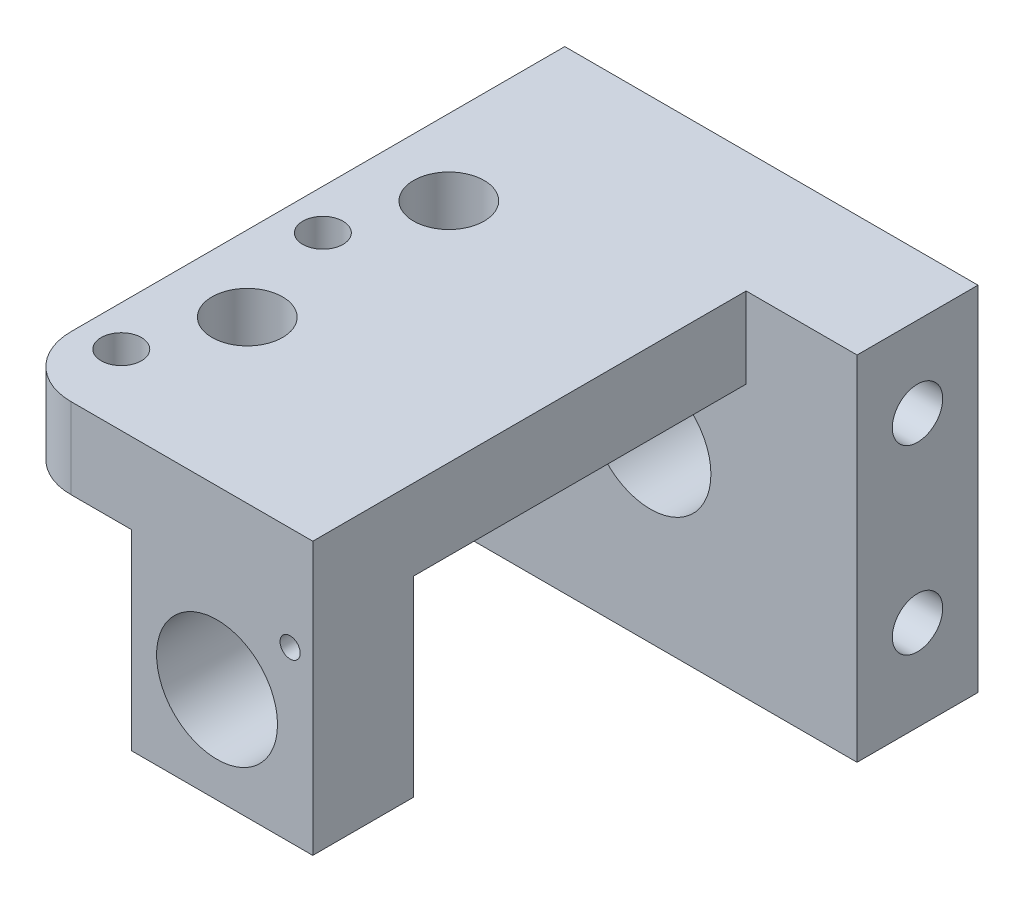
ISO-10303-21;
HEADER;
FILE_DESCRIPTION(('STEP AP214'),'2;1');
FILE_NAME('part.step','',(''),(''),'','','');
FILE_SCHEMA(('AUTOMOTIVE_DESIGN { 1 0 10303 214 1 1 1 1 }'));
ENDSEC;
DATA;
#1=APPLICATION_CONTEXT('core data for automotive mechanical design processes');
#2=APPLICATION_PROTOCOL_DEFINITION('international standard','automotive_design',2000,#1);
#3=PRODUCT_CONTEXT('',#1,'mechanical');
#4=PRODUCT('Part','Part','',(#3));
#5=PRODUCT_RELATED_PRODUCT_CATEGORY('part','',(#4));
#6=PRODUCT_DEFINITION_FORMATION('','',#4);
#7=PRODUCT_DEFINITION_CONTEXT('part definition',#1,'design');
#8=PRODUCT_DEFINITION('design','',#6,#7);
#9=PRODUCT_DEFINITION_SHAPE('','',#8);
#10=(LENGTH_UNIT() NAMED_UNIT(*) SI_UNIT(.MILLI.,.METRE.));
#11=(NAMED_UNIT(*) PLANE_ANGLE_UNIT() SI_UNIT($,.RADIAN.));
#12=(NAMED_UNIT(*) SI_UNIT($,.STERADIAN.) SOLID_ANGLE_UNIT());
#13=UNCERTAINTY_MEASURE_WITH_UNIT(LENGTH_MEASURE(1.E-05),#10,'distance_accuracy_value','');
#14=(GEOMETRIC_REPRESENTATION_CONTEXT(3) GLOBAL_UNCERTAINTY_ASSIGNED_CONTEXT((#13)) GLOBAL_UNIT_ASSIGNED_CONTEXT((#10,
#11,#12)) REPRESENTATION_CONTEXT('',''));
#15=CARTESIAN_POINT('',(0.,0.,0.));
#16=DIRECTION('',(0.,0.,1.));
#17=DIRECTION('',(1.,0.,0.));
#18=AXIS2_PLACEMENT_3D('',#15,#16,#17);
#19=CARTESIAN_POINT('',(-20.5,17.5,12.));
#20=DIRECTION('',(0.,-1.,0.));
#21=DIRECTION('',(1.,0.,0.));
#22=AXIS2_PLACEMENT_3D('',#19,#20,#21);
#23=PLANE('',#22);
#24=CARTESIAN_POINT('',(-13.,17.5,39.));
#25=DIRECTION('',(0.,1.,0.));
#26=DIRECTION('',(0.,0.,1.));
#27=AXIS2_PLACEMENT_3D('',#24,#25,#26);
#28=CIRCLE('',#27,3.49999999999999);
#29=CARTESIAN_POINT('',(-13.,17.5,42.5));
#30=VERTEX_POINT('',#29);
#31=EDGE_CURVE('E182',#30,#30,#28,.T.);
#32=ORIENTED_EDGE('',*,*,#31,.F.);
#33=EDGE_LOOP('',(#32));
#34=FACE_BOUND('',#33,.T.);
#35=CARTESIAN_POINT('',(-13.,17.5,19.));
#36=DIRECTION('',(0.,1.,0.));
#37=DIRECTION('',(0.,0.,1.));
#38=AXIS2_PLACEMENT_3D('',#35,#36,#37);
#39=CIRCLE('',#38,3.49999999999999);
#40=CARTESIAN_POINT('',(-13.,17.5,22.5));
#41=VERTEX_POINT('',#40);
#42=EDGE_CURVE('E191',#41,#41,#39,.T.);
#43=ORIENTED_EDGE('',*,*,#42,.F.);
#44=EDGE_LOOP('',(#43));
#45=FACE_BOUND('',#44,.T.);
#46=CARTESIAN_POINT('',(-16.5,17.5,48.));
#47=DIRECTION('',(0.,1.,0.));
#48=DIRECTION('',(0.,0.,1.));
#49=AXIS2_PLACEMENT_3D('',#46,#47,#48);
#50=CIRCLE('',#49,1.99999999999999);
#51=CARTESIAN_POINT('',(-16.5,17.5,50.));
#52=VERTEX_POINT('',#51);
#53=EDGE_CURVE('E197',#52,#52,#50,.T.);
#54=ORIENTED_EDGE('',*,*,#53,.F.);
#55=EDGE_LOOP('',(#54));
#56=FACE_BOUND('',#55,.T.);
#57=DIRECTION('',(0.,0.,-1.));
#58=VECTOR('',#57,1.);
#59=CARTESIAN_POINT('',(-20.5,17.5,12.));
#60=LINE('',#59,#58);
#61=CARTESIAN_POINT('',(-20.5,17.5,49.));
#62=VERTEX_POINT('',#61);
#63=CARTESIAN_POINT('',(-20.5,17.5,0.));
#64=VERTEX_POINT('',#63);
#65=EDGE_CURVE('E277',#62,#64,#60,.T.);
#66=ORIENTED_EDGE('',*,*,#65,.F.);
#67=CARTESIAN_POINT('',(-14.5,17.5,49.));
#68=DIRECTION('',(0.,-1.,0.));
#69=DIRECTION('',(1.,0.,0.));
#70=AXIS2_PLACEMENT_3D('',#67,#68,#69);
#71=CIRCLE('',#70,6.);
#72=CARTESIAN_POINT('',(-14.5,17.5,55.));
#73=VERTEX_POINT('',#72);
#74=EDGE_CURVE('E69',#62,#73,#71,.F.);
#75=ORIENTED_EDGE('',*,*,#74,.T.);
#76=DIRECTION('',(1.,0.,0.));
#77=VECTOR('',#76,1.);
#78=CARTESIAN_POINT('',(-20.5,17.5,55.));
#79=LINE('',#78,#77);
#80=CARTESIAN_POINT('',(9.5,17.5,55.));
#81=VERTEX_POINT('',#80);
#82=EDGE_CURVE('E227',#73,#81,#79,.T.);
#83=ORIENTED_EDGE('',*,*,#82,.T.);
#84=DIRECTION('',(0.,0.,-1.));
#85=VECTOR('',#84,1.);
#86=CARTESIAN_POINT('',(9.49999999999999,17.5,0.));
#87=LINE('',#86,#85);
#88=CARTESIAN_POINT('',(9.49999999999999,17.5,12.));
#89=VERTEX_POINT('',#88);
#90=EDGE_CURVE('E236',#81,#89,#87,.T.);
#91=ORIENTED_EDGE('',*,*,#90,.T.);
#92=DIRECTION('',(-1.,0.,0.));
#93=VECTOR('',#92,1.);
#94=CARTESIAN_POINT('',(-20.5,17.5,12.));
#95=LINE('',#94,#93);
#96=CARTESIAN_POINT('',(20.5,17.5,12.));
#97=VERTEX_POINT('',#96);
#98=EDGE_CURVE('E256',#97,#89,#95,.T.);
#99=ORIENTED_EDGE('',*,*,#98,.F.);
#100=DIRECTION('',(0.,0.,-1.));
#101=VECTOR('',#100,1.);
#102=CARTESIAN_POINT('',(20.5,17.5,12.));
#103=LINE('',#102,#101);
#104=CARTESIAN_POINT('',(20.5,17.5,0.));
#105=VERTEX_POINT('',#104);
#106=EDGE_CURVE('E279',#97,#105,#103,.T.);
#107=ORIENTED_EDGE('',*,*,#106,.T.);
#108=DIRECTION('',(-1.,0.,0.));
#109=VECTOR('',#108,1.);
#110=CARTESIAN_POINT('',(-20.5,17.5,0.));
#111=LINE('',#110,#109);
#112=EDGE_CURVE('E266',#105,#64,#111,.T.);
#113=ORIENTED_EDGE('',*,*,#112,.T.);
#114=EDGE_LOOP('',(#66,#75,#83,#91,#99,#107,#113));
#115=FACE_BOUND('',#114,.T.);
#116=CARTESIAN_POINT('',(-16.5,17.5,28.));
#117=DIRECTION('',(0.,1.,0.));
#118=DIRECTION('',(0.,0.,1.));
#119=AXIS2_PLACEMENT_3D('',#116,#117,#118);
#120=CIRCLE('',#119,1.99999999999999);
#121=CARTESIAN_POINT('',(-16.5,17.5,30.));
#122=VERTEX_POINT('',#121);
#123=EDGE_CURVE('E201',#122,#122,#120,.T.);
#124=ORIENTED_EDGE('',*,*,#123,.F.);
#125=EDGE_LOOP('',(#124));
#126=FACE_BOUND('',#125,.T.);
#127=ADVANCED_FACE('F45',(#34,#45,#56,#115,#126),#23,.F.);
#128=CARTESIAN_POINT('',(20.5,-17.5,12.));
#129=DIRECTION('',(-1.,0.,0.));
#130=DIRECTION('',(0.,-1.,0.));
#131=AXIS2_PLACEMENT_3D('',#128,#129,#130);
#132=PLANE('',#131);
#133=CARTESIAN_POINT('',(20.5,9.5,6.));
#134=DIRECTION('',(1.,0.,0.));
#135=DIRECTION('',(0.,0.,-1.));
#136=AXIS2_PLACEMENT_3D('',#133,#134,#135);
#137=CIRCLE('',#136,2.49999999999999);
#138=CARTESIAN_POINT('',(20.5,9.5,3.50000000000001));
#139=VERTEX_POINT('',#138);
#140=EDGE_CURVE('E161',#139,#139,#137,.T.);
#141=ORIENTED_EDGE('',*,*,#140,.F.);
#142=EDGE_LOOP('',(#141));
#143=FACE_BOUND('',#142,.T.);
#144=CARTESIAN_POINT('',(20.5,-8.5,6.));
#145=DIRECTION('',(1.,0.,0.));
#146=DIRECTION('',(0.,0.,-1.));
#147=AXIS2_PLACEMENT_3D('',#144,#145,#146);
#148=CIRCLE('',#147,2.49999999999999);
#149=CARTESIAN_POINT('',(20.5,-8.5,3.50000000000001));
#150=VERTEX_POINT('',#149);
#151=EDGE_CURVE('E167',#150,#150,#148,.T.);
#152=ORIENTED_EDGE('',*,*,#151,.F.);
#153=EDGE_LOOP('',(#152));
#154=FACE_BOUND('',#153,.T.);
#155=DIRECTION('',(0.,1.,0.));
#156=VECTOR('',#155,1.);
#157=CARTESIAN_POINT('',(20.5,-17.5,0.));
#158=LINE('',#157,#156);
#159=CARTESIAN_POINT('',(20.5,-17.5,0.));
#160=VERTEX_POINT('',#159);
#161=EDGE_CURVE('E252',#160,#105,#158,.T.);
#162=ORIENTED_EDGE('',*,*,#161,.T.);
#163=ORIENTED_EDGE('',*,*,#106,.F.);
#164=DIRECTION('',(0.,1.,0.));
#165=VECTOR('',#164,1.);
#166=CARTESIAN_POINT('',(20.5,-17.5,12.));
#167=LINE('',#166,#165);
#168=CARTESIAN_POINT('',(20.5,-17.5,12.));
#169=VERTEX_POINT('',#168);
#170=EDGE_CURVE('E253',#169,#97,#167,.T.);
#171=ORIENTED_EDGE('',*,*,#170,.F.);
#172=DIRECTION('',(0.,0.,-1.));
#173=VECTOR('',#172,1.);
#174=CARTESIAN_POINT('',(20.5,-17.5,12.));
#175=LINE('',#174,#173);
#176=EDGE_CURVE('E263',#169,#160,#175,.T.);
#177=ORIENTED_EDGE('',*,*,#176,.T.);
#178=EDGE_LOOP('',(#162,#163,#171,#177));
#179=FACE_BOUND('',#178,.T.);
#180=ADVANCED_FACE('F310',(#143,#154,#179),#132,.F.);
#181=CARTESIAN_POINT('',(-20.5,-17.5,12.));
#182=DIRECTION('',(1.,0.,0.));
#183=DIRECTION('',(0.,1.,0.));
#184=AXIS2_PLACEMENT_3D('',#181,#182,#183);
#185=PLANE('',#184);
#186=CARTESIAN_POINT('',(-20.5,9.5,6.));
#187=DIRECTION('',(-1.,0.,0.));
#188=DIRECTION('',(0.,0.,1.));
#189=AXIS2_PLACEMENT_3D('',#186,#187,#188);
#190=CIRCLE('',#189,2.49999999999999);
#191=CARTESIAN_POINT('',(-20.5,9.5,8.49999999999999));
#192=VERTEX_POINT('',#191);
#193=EDGE_CURVE('E149',#192,#192,#190,.T.);
#194=ORIENTED_EDGE('',*,*,#193,.F.);
#195=EDGE_LOOP('',(#194));
#196=FACE_BOUND('',#195,.T.);
#197=CARTESIAN_POINT('',(-20.5,-8.5,6.));
#198=DIRECTION('',(-1.,0.,0.));
#199=DIRECTION('',(0.,0.,1.));
#200=AXIS2_PLACEMENT_3D('',#197,#198,#199);
#201=CIRCLE('',#200,2.49999999999999);
#202=CARTESIAN_POINT('',(-20.5,-8.5,8.49999999999999));
#203=VERTEX_POINT('',#202);
#204=EDGE_CURVE('E148',#203,#203,#201,.T.);
#205=ORIENTED_EDGE('',*,*,#204,.F.);
#206=EDGE_LOOP('',(#205));
#207=FACE_BOUND('',#206,.T.);
#208=DIRECTION('',(0.,0.,1.));
#209=VECTOR('',#208,1.);
#210=CARTESIAN_POINT('',(-20.5,9.5,0.));
#211=LINE('',#210,#209);
#212=CARTESIAN_POINT('',(-20.5,9.5,12.));
#213=VERTEX_POINT('',#212);
#214=CARTESIAN_POINT('',(-20.5,9.5,49.));
#215=VERTEX_POINT('',#214);
#216=EDGE_CURVE('E232',#213,#215,#211,.T.);
#217=ORIENTED_EDGE('',*,*,#216,.T.);
#218=DIRECTION('',(0.,1.,0.));
#219=VECTOR('',#218,1.);
#220=CARTESIAN_POINT('',(-20.5,17.5,49.));
#221=LINE('',#220,#219);
#222=EDGE_CURVE('E282',#215,#62,#221,.T.);
#223=ORIENTED_EDGE('',*,*,#222,.T.);
#224=ORIENTED_EDGE('',*,*,#65,.T.);
#225=DIRECTION('',(0.,-1.,0.));
#226=VECTOR('',#225,1.);
#227=CARTESIAN_POINT('',(-20.5,-17.5,0.));
#228=LINE('',#227,#226);
#229=CARTESIAN_POINT('',(-20.5,-17.5,0.));
#230=VERTEX_POINT('',#229);
#231=EDGE_CURVE('E269',#64,#230,#228,.T.);
#232=ORIENTED_EDGE('',*,*,#231,.T.);
#233=DIRECTION('',(0.,0.,-1.));
#234=VECTOR('',#233,1.);
#235=CARTESIAN_POINT('',(-20.5,-17.5,12.));
#236=LINE('',#235,#234);
#237=CARTESIAN_POINT('',(-20.5,-17.5,12.));
#238=VERTEX_POINT('',#237);
#239=EDGE_CURVE('E274',#238,#230,#236,.T.);
#240=ORIENTED_EDGE('',*,*,#239,.F.);
#241=DIRECTION('',(0.,-1.,0.));
#242=VECTOR('',#241,1.);
#243=CARTESIAN_POINT('',(-20.5,-17.5,12.));
#244=LINE('',#243,#242);
#245=EDGE_CURVE('E259',#213,#238,#244,.T.);
#246=ORIENTED_EDGE('',*,*,#245,.F.);
#247=EDGE_LOOP('',(#217,#223,#224,#232,#240,#246));
#248=FACE_BOUND('',#247,.T.);
#249=ADVANCED_FACE('F317',(#196,#207,#248),#185,.F.);
#250=CARTESIAN_POINT('',(-20.5,-17.5,12.));
#251=DIRECTION('',(0.,1.,0.));
#252=DIRECTION('',(-1.,0.,0.));
#253=AXIS2_PLACEMENT_3D('',#250,#251,#252);
#254=PLANE('',#253);
#255=DIRECTION('',(1.,0.,0.));
#256=VECTOR('',#255,1.);
#257=CARTESIAN_POINT('',(-20.5,-17.5,0.));
#258=LINE('',#257,#256);
#259=EDGE_CURVE('E257',#230,#160,#258,.T.);
#260=ORIENTED_EDGE('',*,*,#259,.T.);
#261=ORIENTED_EDGE('',*,*,#176,.F.);
#262=DIRECTION('',(1.,0.,0.));
#263=VECTOR('',#262,1.);
#264=CARTESIAN_POINT('',(-20.5,-17.5,12.));
#265=LINE('',#264,#263);
#266=EDGE_CURVE('E261',#238,#169,#265,.T.);
#267=ORIENTED_EDGE('',*,*,#266,.F.);
#268=ORIENTED_EDGE('',*,*,#239,.T.);
#269=EDGE_LOOP('',(#260,#261,#267,#268));
#270=FACE_BOUND('',#269,.T.);
#271=ADVANCED_FACE('F324',(#270),#254,.F.);
#272=CARTESIAN_POINT('',(0.,0.,12.));
#273=DIRECTION('',(0.,0.,-1.));
#274=DIRECTION('',(-1.,0.,0.));
#275=AXIS2_PLACEMENT_3D('',#272,#273,#274);
#276=PLANE('',#275);
#277=CARTESIAN_POINT('',(0.,0.,12.));
#278=DIRECTION('',(0.,0.,-1.));
#279=DIRECTION('',(-1.,0.,0.));
#280=AXIS2_PLACEMENT_3D('',#277,#278,#279);
#281=CIRCLE('',#280,6.);
#282=CARTESIAN_POINT('',(-6.,0.,12.));
#283=VERTEX_POINT('',#282);
#284=EDGE_CURVE('E155',#283,#283,#281,.T.);
#285=ORIENTED_EDGE('',*,*,#284,.T.);
#286=EDGE_LOOP('',(#285));
#287=FACE_BOUND('',#286,.T.);
#288=ORIENTED_EDGE('',*,*,#98,.T.);
#289=DIRECTION('',(0.,-1.,0.));
#290=VECTOR('',#289,1.);
#291=CARTESIAN_POINT('',(9.49999999999999,0.,12.));
#292=LINE('',#291,#290);
#293=CARTESIAN_POINT('',(9.5,9.5,12.));
#294=VERTEX_POINT('',#293);
#295=EDGE_CURVE('E249',#89,#294,#292,.T.);
#296=ORIENTED_EDGE('',*,*,#295,.T.);
#297=DIRECTION('',(1.,0.,0.));
#298=VECTOR('',#297,1.);
#299=CARTESIAN_POINT('',(0.,9.5,12.));
#300=LINE('',#299,#298);
#301=EDGE_CURVE('E246',#213,#294,#300,.T.);
#302=ORIENTED_EDGE('',*,*,#301,.F.);
#303=ORIENTED_EDGE('',*,*,#245,.T.);
#304=ORIENTED_EDGE('',*,*,#266,.T.);
#305=ORIENTED_EDGE('',*,*,#170,.T.);
#306=EDGE_LOOP('',(#288,#296,#302,#303,#304,#305));
#307=FACE_BOUND('',#306,.T.);
#308=ADVANCED_FACE('F328',(#287,#307),#276,.F.);
#309=CARTESIAN_POINT('',(0.,0.,0.));
#310=DIRECTION('',(0.,0.,-1.));
#311=DIRECTION('',(-1.,0.,0.));
#312=AXIS2_PLACEMENT_3D('',#309,#310,#311);
#313=PLANE('',#312);
#314=CARTESIAN_POINT('',(0.,0.,0.));
#315=DIRECTION('',(0.,0.,1.));
#316=DIRECTION('',(1.,0.,0.));
#317=AXIS2_PLACEMENT_3D('',#314,#315,#316);
#318=CIRCLE('',#317,6.);
#319=CARTESIAN_POINT('',(6.,0.,0.));
#320=VERTEX_POINT('',#319);
#321=EDGE_CURVE('E549',#320,#320,#318,.T.);
#322=ORIENTED_EDGE('',*,*,#321,.T.);
#323=EDGE_LOOP('',(#322));
#324=FACE_BOUND('',#323,.T.);
#325=ORIENTED_EDGE('',*,*,#231,.F.);
#326=ORIENTED_EDGE('',*,*,#112,.F.);
#327=ORIENTED_EDGE('',*,*,#161,.F.);
#328=ORIENTED_EDGE('',*,*,#259,.F.);
#329=EDGE_LOOP('',(#325,#326,#327,#328));
#330=FACE_BOUND('',#329,.T.);
#331=ADVANCED_FACE('F330',(#324,#330),#313,.T.);
#332=CARTESIAN_POINT('',(9.49999999999999,9.5,0.));
#333=DIRECTION('',(1.,0.,0.));
#334=DIRECTION('',(0.,0.,-1.));
#335=AXIS2_PLACEMENT_3D('',#332,#333,#334);
#336=PLANE('',#335);
#337=ORIENTED_EDGE('',*,*,#295,.F.);
#338=ORIENTED_EDGE('',*,*,#90,.F.);
#339=DIRECTION('',(0.,1.,0.));
#340=VECTOR('',#339,1.);
#341=CARTESIAN_POINT('',(9.5,9.5,55.));
#342=LINE('',#341,#340);
#343=CARTESIAN_POINT('',(9.5,-9.5,55.));
#344=VERTEX_POINT('',#343);
#345=EDGE_CURVE('E240',#344,#81,#342,.T.);
#346=ORIENTED_EDGE('',*,*,#345,.F.);
#347=DIRECTION('',(0.,0.,1.));
#348=VECTOR('',#347,1.);
#349=CARTESIAN_POINT('',(9.5,-9.5,45.));
#350=LINE('',#349,#348);
#351=CARTESIAN_POINT('',(9.5,-9.5,45.));
#352=VERTEX_POINT('',#351);
#353=EDGE_CURVE('E224',#352,#344,#350,.T.);
#354=ORIENTED_EDGE('',*,*,#353,.F.);
#355=DIRECTION('',(0.,1.,0.));
#356=VECTOR('',#355,1.);
#357=CARTESIAN_POINT('',(9.5,9.5,45.));
#358=LINE('',#357,#356);
#359=CARTESIAN_POINT('',(9.5,9.5,45.));
#360=VERTEX_POINT('',#359);
#361=EDGE_CURVE('E205',#352,#360,#358,.T.);
#362=ORIENTED_EDGE('',*,*,#361,.T.);
#363=DIRECTION('',(0.,0.,-1.));
#364=VECTOR('',#363,1.);
#365=CARTESIAN_POINT('',(9.49999999999999,9.5,0.));
#366=LINE('',#365,#364);
#367=EDGE_CURVE('E238',#360,#294,#366,.T.);
#368=ORIENTED_EDGE('',*,*,#367,.T.);
#369=EDGE_LOOP('',(#337,#338,#346,#354,#362,#368));
#370=FACE_BOUND('',#369,.T.);
#371=ADVANCED_FACE('F333',(#370),#336,.T.);
#372=CARTESIAN_POINT('',(0.,9.5,0.));
#373=DIRECTION('',(0.,1.,0.));
#374=DIRECTION('',(0.,0.,1.));
#375=AXIS2_PLACEMENT_3D('',#372,#373,#374);
#376=PLANE('',#375);
#377=CARTESIAN_POINT('',(-13.,9.5,39.));
#378=DIRECTION('',(0.,1.,0.));
#379=DIRECTION('',(0.,0.,1.));
#380=AXIS2_PLACEMENT_3D('',#377,#378,#379);
#381=CIRCLE('',#380,5.5);
#382=CARTESIAN_POINT('',(-13.,9.5,44.5));
#383=VERTEX_POINT('',#382);
#384=EDGE_CURVE('E177',#383,#383,#381,.T.);
#385=ORIENTED_EDGE('',*,*,#384,.T.);
#386=EDGE_LOOP('',(#385));
#387=FACE_BOUND('',#386,.T.);
#388=CARTESIAN_POINT('',(-13.,9.5,19.));
#389=DIRECTION('',(0.,1.,0.));
#390=DIRECTION('',(0.,0.,1.));
#391=AXIS2_PLACEMENT_3D('',#388,#389,#390);
#392=CIRCLE('',#391,5.5);
#393=CARTESIAN_POINT('',(-13.,9.5,24.5));
#394=VERTEX_POINT('',#393);
#395=EDGE_CURVE('E188',#394,#394,#392,.T.);
#396=ORIENTED_EDGE('',*,*,#395,.T.);
#397=EDGE_LOOP('',(#396));
#398=FACE_BOUND('',#397,.T.);
#399=CARTESIAN_POINT('',(-16.5,9.5,48.));
#400=DIRECTION('',(0.,1.,0.));
#401=DIRECTION('',(0.,0.,1.));
#402=AXIS2_PLACEMENT_3D('',#399,#400,#401);
#403=CIRCLE('',#402,1.99999999999999);
#404=CARTESIAN_POINT('',(-16.5,9.5,50.));
#405=VERTEX_POINT('',#404);
#406=EDGE_CURVE('E200',#405,#405,#403,.T.);
#407=ORIENTED_EDGE('',*,*,#406,.T.);
#408=EDGE_LOOP('',(#407));
#409=FACE_BOUND('',#408,.T.);
#410=CARTESIAN_POINT('',(-16.5,9.5,28.));
#411=DIRECTION('',(0.,1.,0.));
#412=DIRECTION('',(0.,0.,1.));
#413=AXIS2_PLACEMENT_3D('',#410,#411,#412);
#414=CIRCLE('',#413,1.99999999999999);
#415=CARTESIAN_POINT('',(-16.5,9.5,30.));
#416=VERTEX_POINT('',#415);
#417=EDGE_CURVE('E204',#416,#416,#414,.T.);
#418=ORIENTED_EDGE('',*,*,#417,.T.);
#419=EDGE_LOOP('',(#418));
#420=FACE_BOUND('',#419,.T.);
#421=DIRECTION('',(1.,0.,0.));
#422=VECTOR('',#421,1.);
#423=CARTESIAN_POINT('',(-20.5,9.5,55.));
#424=LINE('',#423,#422);
#425=CARTESIAN_POINT('',(-14.5,9.5,55.));
#426=VERTEX_POINT('',#425);
#427=CARTESIAN_POINT('',(-8.5,9.5,55.));
#428=VERTEX_POINT('',#427);
#429=EDGE_CURVE('E235',#426,#428,#424,.T.);
#430=ORIENTED_EDGE('',*,*,#429,.F.);
#431=CARTESIAN_POINT('',(-14.5,9.5,49.));
#432=DIRECTION('',(0.,1.,0.));
#433=DIRECTION('',(0.,0.,1.));
#434=AXIS2_PLACEMENT_3D('',#431,#432,#433);
#435=CIRCLE('',#434,6.);
#436=EDGE_CURVE('E11',#426,#215,#435,.F.);
#437=ORIENTED_EDGE('',*,*,#436,.T.);
#438=ORIENTED_EDGE('',*,*,#216,.F.);
#439=ORIENTED_EDGE('',*,*,#301,.T.);
#440=ORIENTED_EDGE('',*,*,#367,.F.);
#441=DIRECTION('',(-1.,0.,0.));
#442=VECTOR('',#441,1.);
#443=CARTESIAN_POINT('',(9.5,9.5,45.));
#444=LINE('',#443,#442);
#445=CARTESIAN_POINT('',(-8.5,9.5,45.));
#446=VERTEX_POINT('',#445);
#447=EDGE_CURVE('E208',#360,#446,#444,.T.);
#448=ORIENTED_EDGE('',*,*,#447,.T.);
#449=DIRECTION('',(0.,0.,1.));
#450=VECTOR('',#449,1.);
#451=CARTESIAN_POINT('',(-8.5,9.5,45.));
#452=LINE('',#451,#450);
#453=EDGE_CURVE('E218',#446,#428,#452,.T.);
#454=ORIENTED_EDGE('',*,*,#453,.T.);
#455=EDGE_LOOP('',(#430,#437,#438,#439,#440,#448,#454));
#456=FACE_BOUND('',#455,.T.);
#457=ADVANCED_FACE('F291',(#387,#398,#409,#420,#456),#376,.F.);
#458=CARTESIAN_POINT('',(-20.5,9.5,55.));
#459=DIRECTION('',(0.,0.,1.));
#460=DIRECTION('',(1.,0.,0.));
#461=AXIS2_PLACEMENT_3D('',#458,#459,#460);
#462=PLANE('',#461);
#463=CARTESIAN_POINT('',(0.,0.,55.));
#464=DIRECTION('',(0.,0.,1.));
#465=DIRECTION('',(1.,0.,0.));
#466=AXIS2_PLACEMENT_3D('',#463,#464,#465);
#467=CIRCLE('',#466,6.);
#468=CARTESIAN_POINT('',(6.,0.,55.));
#469=VERTEX_POINT('',#468);
#470=EDGE_CURVE('E553',#469,#469,#467,.T.);
#471=ORIENTED_EDGE('',*,*,#470,.F.);
#472=EDGE_LOOP('',(#471));
#473=FACE_BOUND('',#472,.T.);
#474=CARTESIAN_POINT('',(7.25,7.25,55.));
#475=DIRECTION('',(0.,0.,1.));
#476=DIRECTION('',(1.,0.,0.));
#477=AXIS2_PLACEMENT_3D('',#474,#475,#476);
#478=CIRCLE('',#477,1.);
#479=CARTESIAN_POINT('',(8.25,7.25,55.));
#480=VERTEX_POINT('',#479);
#481=EDGE_CURVE('E173',#480,#480,#478,.T.);
#482=ORIENTED_EDGE('',*,*,#481,.F.);
#483=EDGE_LOOP('',(#482));
#484=FACE_BOUND('',#483,.T.);
#485=ORIENTED_EDGE('',*,*,#82,.F.);
#486=DIRECTION('',(0.,1.,0.));
#487=VECTOR('',#486,1.);
#488=CARTESIAN_POINT('',(-14.5,9.5,55.));
#489=LINE('',#488,#487);
#490=EDGE_CURVE('E54',#73,#426,#489,.F.);
#491=ORIENTED_EDGE('',*,*,#490,.T.);
#492=ORIENTED_EDGE('',*,*,#429,.T.);
#493=DIRECTION('',(0.,-1.,0.));
#494=VECTOR('',#493,1.);
#495=CARTESIAN_POINT('',(-8.5,9.5,55.));
#496=LINE('',#495,#494);
#497=CARTESIAN_POINT('',(-8.5,-9.5,55.));
#498=VERTEX_POINT('',#497);
#499=EDGE_CURVE('E219',#428,#498,#496,.T.);
#500=ORIENTED_EDGE('',*,*,#499,.T.);
#501=DIRECTION('',(1.,0.,0.));
#502=VECTOR('',#501,1.);
#503=CARTESIAN_POINT('',(9.5,-9.5,55.));
#504=LINE('',#503,#502);
#505=EDGE_CURVE('E209',#498,#344,#504,.T.);
#506=ORIENTED_EDGE('',*,*,#505,.T.);
#507=ORIENTED_EDGE('',*,*,#345,.T.);
#508=EDGE_LOOP('',(#485,#491,#492,#500,#506,#507));
#509=FACE_BOUND('',#508,.T.);
#510=ADVANCED_FACE('F338',(#473,#484,#509),#462,.T.);
#511=CARTESIAN_POINT('',(9.5,-9.5,45.));
#512=DIRECTION('',(0.,-1.,0.));
#513=DIRECTION('',(1.,0.,0.));
#514=AXIS2_PLACEMENT_3D('',#511,#512,#513);
#515=PLANE('',#514);
#516=ORIENTED_EDGE('',*,*,#505,.F.);
#517=DIRECTION('',(0.,0.,1.));
#518=VECTOR('',#517,1.);
#519=CARTESIAN_POINT('',(-8.5,-9.5,45.));
#520=LINE('',#519,#518);
#521=CARTESIAN_POINT('',(-8.5,-9.5,45.));
#522=VERTEX_POINT('',#521);
#523=EDGE_CURVE('E228',#522,#498,#520,.T.);
#524=ORIENTED_EDGE('',*,*,#523,.F.);
#525=DIRECTION('',(1.,0.,0.));
#526=VECTOR('',#525,1.);
#527=CARTESIAN_POINT('',(9.5,-9.5,45.));
#528=LINE('',#527,#526);
#529=EDGE_CURVE('E215',#522,#352,#528,.T.);
#530=ORIENTED_EDGE('',*,*,#529,.T.);
#531=ORIENTED_EDGE('',*,*,#353,.T.);
#532=EDGE_LOOP('',(#516,#524,#530,#531));
#533=FACE_BOUND('',#532,.T.);
#534=ADVANCED_FACE('F341',(#533),#515,.T.);
#535=CARTESIAN_POINT('',(-8.5,9.5,45.));
#536=DIRECTION('',(-1.,0.,0.));
#537=DIRECTION('',(0.,0.,1.));
#538=AXIS2_PLACEMENT_3D('',#535,#536,#537);
#539=PLANE('',#538);
#540=ORIENTED_EDGE('',*,*,#499,.F.);
#541=ORIENTED_EDGE('',*,*,#453,.F.);
#542=DIRECTION('',(0.,-1.,0.));
#543=VECTOR('',#542,1.);
#544=CARTESIAN_POINT('',(-8.5,9.5,45.));
#545=LINE('',#544,#543);
#546=EDGE_CURVE('E212',#446,#522,#545,.T.);
#547=ORIENTED_EDGE('',*,*,#546,.T.);
#548=ORIENTED_EDGE('',*,*,#523,.T.);
#549=EDGE_LOOP('',(#540,#541,#547,#548));
#550=FACE_BOUND('',#549,.T.);
#551=ADVANCED_FACE('F348',(#550),#539,.T.);
#552=CARTESIAN_POINT('',(0.,0.,45.));
#553=DIRECTION('',(0.,0.,-1.));
#554=DIRECTION('',(-1.,0.,0.));
#555=AXIS2_PLACEMENT_3D('',#552,#553,#554);
#556=PLANE('',#555);
#557=CARTESIAN_POINT('',(0.,0.,45.));
#558=DIRECTION('',(0.,0.,-1.));
#559=DIRECTION('',(-1.,0.,0.));
#560=AXIS2_PLACEMENT_3D('',#557,#558,#559);
#561=CIRCLE('',#560,6.);
#562=CARTESIAN_POINT('',(-6.,0.,45.));
#563=VERTEX_POINT('',#562);
#564=EDGE_CURVE('E49',#563,#563,#561,.T.);
#565=ORIENTED_EDGE('',*,*,#564,.F.);
#566=EDGE_LOOP('',(#565));
#567=FACE_BOUND('',#566,.T.);
#568=CARTESIAN_POINT('',(7.25,7.25,45.));
#569=DIRECTION('',(0.,0.,1.));
#570=DIRECTION('',(1.,0.,0.));
#571=AXIS2_PLACEMENT_3D('',#568,#569,#570);
#572=CIRCLE('',#571,1.);
#573=CARTESIAN_POINT('',(8.25,7.25,45.));
#574=VERTEX_POINT('',#573);
#575=EDGE_CURVE('E174',#574,#574,#572,.T.);
#576=ORIENTED_EDGE('',*,*,#575,.T.);
#577=EDGE_LOOP('',(#576));
#578=FACE_BOUND('',#577,.T.);
#579=ORIENTED_EDGE('',*,*,#361,.F.);
#580=ORIENTED_EDGE('',*,*,#529,.F.);
#581=ORIENTED_EDGE('',*,*,#546,.F.);
#582=ORIENTED_EDGE('',*,*,#447,.F.);
#583=EDGE_LOOP('',(#579,#580,#581,#582));
#584=FACE_BOUND('',#583,.T.);
#585=ADVANCED_FACE('F351',(#567,#578,#584),#556,.T.);
#586=CARTESIAN_POINT('',(-14.5,-17.5,49.));
#587=DIRECTION('',(0.,-1.,0.));
#588=DIRECTION('',(1.,0.,0.));
#589=AXIS2_PLACEMENT_3D('',#586,#587,#588);
#590=CYLINDRICAL_SURFACE('',#589,6.);
#591=ORIENTED_EDGE('',*,*,#436,.F.);
#592=ORIENTED_EDGE('',*,*,#490,.F.);
#593=ORIENTED_EDGE('',*,*,#74,.F.);
#594=ORIENTED_EDGE('',*,*,#222,.F.);
#595=EDGE_LOOP('',(#591,#592,#593,#594));
#596=FACE_BOUND('',#595,.T.);
#597=ADVANCED_FACE('F47',(#596),#590,.T.);
#598=CARTESIAN_POINT('',(-16.5,17.5,28.));
#599=DIRECTION('',(0.,1.,0.));
#600=DIRECTION('',(0.,0.,1.));
#601=AXIS2_PLACEMENT_3D('',#598,#599,#600);
#602=CYLINDRICAL_SURFACE('',#601,1.99999999999999);
#603=ORIENTED_EDGE('',*,*,#123,.T.);
#604=EDGE_LOOP('',(#603));
#605=FACE_BOUND('',#604,.T.);
#606=ORIENTED_EDGE('',*,*,#417,.F.);
#607=EDGE_LOOP('',(#606));
#608=FACE_BOUND('',#607,.T.);
#609=ADVANCED_FACE('F297',(#605,#608),#602,.F.);
#610=CARTESIAN_POINT('',(-16.5,17.5,48.));
#611=DIRECTION('',(0.,1.,0.));
#612=DIRECTION('',(0.,0.,1.));
#613=AXIS2_PLACEMENT_3D('',#610,#611,#612);
#614=CYLINDRICAL_SURFACE('',#613,1.99999999999999);
#615=ORIENTED_EDGE('',*,*,#53,.T.);
#616=EDGE_LOOP('',(#615));
#617=FACE_BOUND('',#616,.T.);
#618=ORIENTED_EDGE('',*,*,#406,.F.);
#619=EDGE_LOOP('',(#618));
#620=FACE_BOUND('',#619,.T.);
#621=ADVANCED_FACE('F294',(#617,#620),#614,.F.);
#622=CARTESIAN_POINT('',(-13.,11.5,19.));
#623=DIRECTION('',(0.,-1.,0.));
#624=DIRECTION('',(0.,0.,-1.));
#625=AXIS2_PLACEMENT_3D('',#622,#623,#624);
#626=CONICAL_SURFACE('',#625,3.5,0.785398163397449);
#627=ORIENTED_EDGE('',*,*,#395,.F.);
#628=EDGE_LOOP('',(#627));
#629=FACE_BOUND('',#628,.T.);
#630=CARTESIAN_POINT('',(-13.,11.5,19.));
#631=DIRECTION('',(0.,1.,0.));
#632=DIRECTION('',(0.,0.,1.));
#633=AXIS2_PLACEMENT_3D('',#630,#631,#632);
#634=CIRCLE('',#633,3.5);
#635=CARTESIAN_POINT('',(-13.,11.5,22.5));
#636=VERTEX_POINT('',#635);
#637=EDGE_CURVE('E194',#636,#636,#634,.T.);
#638=ORIENTED_EDGE('',*,*,#637,.T.);
#639=EDGE_LOOP('',(#638));
#640=FACE_BOUND('',#639,.T.);
#641=ADVANCED_FACE('F296',(#629,#640),#626,.F.);
#642=CARTESIAN_POINT('',(-13.,17.5,19.));
#643=DIRECTION('',(0.,1.,0.));
#644=DIRECTION('',(0.,0.,1.));
#645=AXIS2_PLACEMENT_3D('',#642,#643,#644);
#646=CYLINDRICAL_SURFACE('',#645,3.49999999999999);
#647=ORIENTED_EDGE('',*,*,#637,.F.);
#648=EDGE_LOOP('',(#647));
#649=FACE_BOUND('',#648,.T.);
#650=ORIENTED_EDGE('',*,*,#42,.T.);
#651=EDGE_LOOP('',(#650));
#652=FACE_BOUND('',#651,.T.);
#653=ADVANCED_FACE('F305',(#649,#652),#646,.F.);
#654=CARTESIAN_POINT('',(-13.,11.5,39.));
#655=DIRECTION('',(0.,-1.,0.));
#656=DIRECTION('',(0.,0.,-1.));
#657=AXIS2_PLACEMENT_3D('',#654,#655,#656);
#658=CONICAL_SURFACE('',#657,3.5,0.785398163397449);
#659=ORIENTED_EDGE('',*,*,#384,.F.);
#660=EDGE_LOOP('',(#659));
#661=FACE_BOUND('',#660,.T.);
#662=CARTESIAN_POINT('',(-13.,11.5,39.));
#663=DIRECTION('',(0.,1.,0.));
#664=DIRECTION('',(0.,0.,1.));
#665=AXIS2_PLACEMENT_3D('',#662,#663,#664);
#666=CIRCLE('',#665,3.5);
#667=CARTESIAN_POINT('',(-13.,11.5,42.5));
#668=VERTEX_POINT('',#667);
#669=EDGE_CURVE('E185',#668,#668,#666,.T.);
#670=ORIENTED_EDGE('',*,*,#669,.T.);
#671=EDGE_LOOP('',(#670));
#672=FACE_BOUND('',#671,.T.);
#673=ADVANCED_FACE('F414',(#661,#672),#658,.F.);
#674=CARTESIAN_POINT('',(-13.,17.5,39.));
#675=DIRECTION('',(0.,1.,0.));
#676=DIRECTION('',(0.,0.,1.));
#677=AXIS2_PLACEMENT_3D('',#674,#675,#676);
#678=CYLINDRICAL_SURFACE('',#677,3.49999999999999);
#679=ORIENTED_EDGE('',*,*,#669,.F.);
#680=EDGE_LOOP('',(#679));
#681=FACE_BOUND('',#680,.T.);
#682=ORIENTED_EDGE('',*,*,#31,.T.);
#683=EDGE_LOOP('',(#682));
#684=FACE_BOUND('',#683,.T.);
#685=ADVANCED_FACE('F402',(#681,#684),#678,.F.);
#686=CARTESIAN_POINT('',(7.25,7.25,45.));
#687=DIRECTION('',(0.,0.,1.));
#688=DIRECTION('',(1.,0.,0.));
#689=AXIS2_PLACEMENT_3D('',#686,#687,#688);
#690=CYLINDRICAL_SURFACE('',#689,1.);
#691=ORIENTED_EDGE('',*,*,#575,.F.);
#692=EDGE_LOOP('',(#691));
#693=FACE_BOUND('',#692,.T.);
#694=ORIENTED_EDGE('',*,*,#481,.T.);
#695=EDGE_LOOP('',(#694));
#696=FACE_BOUND('',#695,.T.);
#697=ADVANCED_FACE('F398',(#693,#696),#690,.F.);
#698=CARTESIAN_POINT('',(8.5,-8.5,6.));
#699=DIRECTION('',(1.,0.,0.));
#700=DIRECTION('',(0.,0.,-1.));
#701=AXIS2_PLACEMENT_3D('',#698,#699,#700);
#702=CONICAL_SURFACE('',#701,2.5,1.02974425867665);
#703=CARTESIAN_POINT('',(6.9978484524311,-8.5,6.));
#704=VERTEX_POINT('',#703);
#705=VERTEX_LOOP('',#704);
#706=FACE_BOUND('',#705,.T.);
#707=CARTESIAN_POINT('',(8.5,-8.5,6.));
#708=DIRECTION('',(1.,0.,0.));
#709=DIRECTION('',(0.,0.,-1.));
#710=AXIS2_PLACEMENT_3D('',#707,#708,#709);
#711=CIRCLE('',#710,2.5);
#712=CARTESIAN_POINT('',(8.5,-8.5,3.5));
#713=VERTEX_POINT('',#712);
#714=EDGE_CURVE('E170',#713,#713,#711,.T.);
#715=ORIENTED_EDGE('',*,*,#714,.T.);
#716=EDGE_LOOP('',(#715));
#717=FACE_BOUND('',#716,.T.);
#718=ADVANCED_FACE('F401',(#706,#717),#702,.F.);
#719=CARTESIAN_POINT('',(20.5,-8.5,6.));
#720=DIRECTION('',(1.,0.,0.));
#721=DIRECTION('',(0.,0.,-1.));
#722=AXIS2_PLACEMENT_3D('',#719,#720,#721);
#723=CYLINDRICAL_SURFACE('',#722,2.49999999999999);
#724=ORIENTED_EDGE('',*,*,#714,.F.);
#725=EDGE_LOOP('',(#724));
#726=FACE_BOUND('',#725,.T.);
#727=ORIENTED_EDGE('',*,*,#151,.T.);
#728=EDGE_LOOP('',(#727));
#729=FACE_BOUND('',#728,.T.);
#730=ADVANCED_FACE('F411',(#726,#729),#723,.F.);
#731=CARTESIAN_POINT('',(8.5,9.5,6.));
#732=DIRECTION('',(1.,0.,0.));
#733=DIRECTION('',(0.,0.,-1.));
#734=AXIS2_PLACEMENT_3D('',#731,#732,#733);
#735=CONICAL_SURFACE('',#734,2.5,1.02974425867665);
#736=CARTESIAN_POINT('',(6.9978484524311,9.5,6.));
#737=VERTEX_POINT('',#736);
#738=VERTEX_LOOP('',#737);
#739=FACE_BOUND('',#738,.T.);
#740=CARTESIAN_POINT('',(8.5,9.5,6.));
#741=DIRECTION('',(1.,0.,0.));
#742=DIRECTION('',(0.,0.,-1.));
#743=AXIS2_PLACEMENT_3D('',#740,#741,#742);
#744=CIRCLE('',#743,2.5);
#745=CARTESIAN_POINT('',(8.5,9.5,3.5));
#746=VERTEX_POINT('',#745);
#747=EDGE_CURVE('E164',#746,#746,#744,.T.);
#748=ORIENTED_EDGE('',*,*,#747,.T.);
#749=EDGE_LOOP('',(#748));
#750=FACE_BOUND('',#749,.T.);
#751=ADVANCED_FACE('F465',(#739,#750),#735,.F.);
#752=CARTESIAN_POINT('',(20.5,9.5,6.));
#753=DIRECTION('',(1.,0.,0.));
#754=DIRECTION('',(0.,0.,-1.));
#755=AXIS2_PLACEMENT_3D('',#752,#753,#754);
#756=CYLINDRICAL_SURFACE('',#755,2.49999999999999);
#757=ORIENTED_EDGE('',*,*,#747,.F.);
#758=EDGE_LOOP('',(#757));
#759=FACE_BOUND('',#758,.T.);
#760=ORIENTED_EDGE('',*,*,#140,.T.);
#761=EDGE_LOOP('',(#760));
#762=FACE_BOUND('',#761,.T.);
#763=ADVANCED_FACE('F475',(#759,#762),#756,.F.);
#764=CARTESIAN_POINT('',(-8.5,-8.5,6.));
#765=DIRECTION('',(-1.,0.,0.));
#766=DIRECTION('',(0.,0.,1.));
#767=AXIS2_PLACEMENT_3D('',#764,#765,#766);
#768=CONICAL_SURFACE('',#767,2.5,1.02974425867665);
#769=CARTESIAN_POINT('',(-6.9978484524311,-8.5,6.));
#770=VERTEX_POINT('',#769);
#771=VERTEX_LOOP('',#770);
#772=FACE_BOUND('',#771,.T.);
#773=CARTESIAN_POINT('',(-8.5,-8.5,6.));
#774=DIRECTION('',(-1.,0.,0.));
#775=DIRECTION('',(0.,0.,1.));
#776=AXIS2_PLACEMENT_3D('',#773,#774,#775);
#777=CIRCLE('',#776,2.5);
#778=CARTESIAN_POINT('',(-8.5,-8.5,8.5));
#779=VERTEX_POINT('',#778);
#780=EDGE_CURVE('E152',#779,#779,#777,.T.);
#781=ORIENTED_EDGE('',*,*,#780,.T.);
#782=EDGE_LOOP('',(#781));
#783=FACE_BOUND('',#782,.T.);
#784=ADVANCED_FACE('F486',(#772,#783),#768,.F.);
#785=CARTESIAN_POINT('',(-20.5,-8.5,6.));
#786=DIRECTION('',(-1.,0.,0.));
#787=DIRECTION('',(0.,0.,1.));
#788=AXIS2_PLACEMENT_3D('',#785,#786,#787);
#789=CYLINDRICAL_SURFACE('',#788,2.49999999999999);
#790=ORIENTED_EDGE('',*,*,#780,.F.);
#791=EDGE_LOOP('',(#790));
#792=FACE_BOUND('',#791,.T.);
#793=ORIENTED_EDGE('',*,*,#204,.T.);
#794=EDGE_LOOP('',(#793));
#795=FACE_BOUND('',#794,.T.);
#796=ADVANCED_FACE('F142',(#792,#795),#789,.F.);
#797=CARTESIAN_POINT('',(-8.5,9.5,6.));
#798=DIRECTION('',(-1.,0.,0.));
#799=DIRECTION('',(0.,0.,1.));
#800=AXIS2_PLACEMENT_3D('',#797,#798,#799);
#801=CONICAL_SURFACE('',#800,2.5,1.02974425867665);
#802=CARTESIAN_POINT('',(-6.9978484524311,9.5,6.));
#803=VERTEX_POINT('',#802);
#804=VERTEX_LOOP('',#803);
#805=FACE_BOUND('',#804,.T.);
#806=CARTESIAN_POINT('',(-8.5,9.5,6.));
#807=DIRECTION('',(-1.,0.,0.));
#808=DIRECTION('',(0.,0.,1.));
#809=AXIS2_PLACEMENT_3D('',#806,#807,#808);
#810=CIRCLE('',#809,2.5);
#811=CARTESIAN_POINT('',(-8.5,9.5,8.5));
#812=VERTEX_POINT('',#811);
#813=EDGE_CURVE('E146',#812,#812,#810,.T.);
#814=ORIENTED_EDGE('',*,*,#813,.T.);
#815=EDGE_LOOP('',(#814));
#816=FACE_BOUND('',#815,.T.);
#817=ADVANCED_FACE('F138',(#805,#816),#801,.F.);
#818=CARTESIAN_POINT('',(-20.5,9.5,6.));
#819=DIRECTION('',(-1.,0.,0.));
#820=DIRECTION('',(0.,0.,1.));
#821=AXIS2_PLACEMENT_3D('',#818,#819,#820);
#822=CYLINDRICAL_SURFACE('',#821,2.49999999999999);
#823=ORIENTED_EDGE('',*,*,#813,.F.);
#824=EDGE_LOOP('',(#823));
#825=FACE_BOUND('',#824,.T.);
#826=ORIENTED_EDGE('',*,*,#193,.T.);
#827=EDGE_LOOP('',(#826));
#828=FACE_BOUND('',#827,.T.);
#829=ADVANCED_FACE('F141',(#825,#828),#822,.F.);
#830=CARTESIAN_POINT('',(0.,0.,0.));
#831=DIRECTION('',(0.,0.,1.));
#832=DIRECTION('',(1.,0.,0.));
#833=AXIS2_PLACEMENT_3D('',#830,#831,#832);
#834=CYLINDRICAL_SURFACE('',#833,6.);
#835=ORIENTED_EDGE('',*,*,#564,.T.);
#836=EDGE_LOOP('',(#835));
#837=FACE_BOUND('',#836,.T.);
#838=ORIENTED_EDGE('',*,*,#470,.T.);
#839=EDGE_LOOP('',(#838));
#840=FACE_BOUND('',#839,.T.);
#841=ADVANCED_FACE('F525',(#837,#840),#834,.F.);
#842=ORIENTED_EDGE('',*,*,#321,.F.);
#843=EDGE_LOOP('',(#842));
#844=FACE_BOUND('',#843,.T.);
#845=ORIENTED_EDGE('',*,*,#284,.F.);
#846=EDGE_LOOP('',(#845));
#847=FACE_BOUND('',#846,.T.);
#848=ADVANCED_FACE('F534',(#844,#847),#834,.F.);
#849=CLOSED_SHELL('',(#127,#180,#249,#271,#308,#331,#371,#457,#510,#534,#551,#585,#597,#609,
#621,#641,#653,#673,#685,#697,#718,#730,#751,#763,#784,#796,#817,#829,#841,#848));
#850=MANIFOLD_SOLID_BREP('B2',#849);
#851=ADVANCED_BREP_SHAPE_REPRESENTATION('',(#18,#850),#14);
#852=SHAPE_DEFINITION_REPRESENTATION(#9,#851);
ENDSEC;
END-ISO-10303-21;
